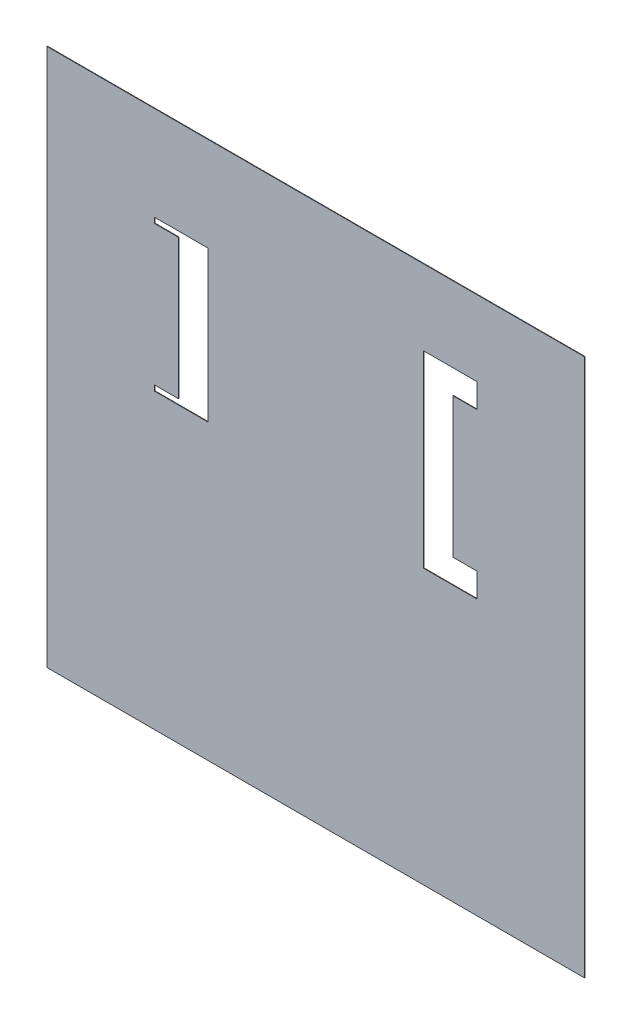
ISO-10303-21;
HEADER;
FILE_DESCRIPTION(('STEP AP214'),'2;1');
FILE_NAME('part.step','',(''),(''),'','','');
FILE_SCHEMA(('AUTOMOTIVE_DESIGN { 1 0 10303 214 1 1 1 1 }'));
ENDSEC;
DATA;
#1=APPLICATION_CONTEXT('core data for automotive mechanical design processes');
#2=APPLICATION_PROTOCOL_DEFINITION('international standard','automotive_design',2000,#1);
#3=PRODUCT_CONTEXT('',#1,'mechanical');
#4=PRODUCT('Part','Part','',(#3));
#5=PRODUCT_RELATED_PRODUCT_CATEGORY('part','',(#4));
#6=PRODUCT_DEFINITION_FORMATION('','',#4);
#7=PRODUCT_DEFINITION_CONTEXT('part definition',#1,'design');
#8=PRODUCT_DEFINITION('design','',#6,#7);
#9=PRODUCT_DEFINITION_SHAPE('','',#8);
#10=(LENGTH_UNIT() NAMED_UNIT(*) SI_UNIT(.MILLI.,.METRE.));
#11=(NAMED_UNIT(*) PLANE_ANGLE_UNIT() SI_UNIT($,.RADIAN.));
#12=(NAMED_UNIT(*) SI_UNIT($,.STERADIAN.) SOLID_ANGLE_UNIT());
#13=UNCERTAINTY_MEASURE_WITH_UNIT(LENGTH_MEASURE(1.E-05),#10,'distance_accuracy_value','');
#14=(GEOMETRIC_REPRESENTATION_CONTEXT(3) GLOBAL_UNCERTAINTY_ASSIGNED_CONTEXT((#13)) GLOBAL_UNIT_ASSIGNED_CONTEXT((#10,
#11,#12)) REPRESENTATION_CONTEXT('',''));
#15=CARTESIAN_POINT('',(0.,0.,0.));
#16=DIRECTION('',(0.,0.,1.));
#17=DIRECTION('',(1.,0.,0.));
#18=AXIS2_PLACEMENT_3D('',#15,#16,#17);
#19=CARTESIAN_POINT('',(0.,0.,0.0254));
#20=DIRECTION('',(1.,0.,0.));
#21=DIRECTION('',(0.,0.,-1.));
#22=AXIS2_PLACEMENT_3D('',#19,#20,#21);
#23=PLANE('',#22);
#24=DIRECTION('',(0.,-1.,0.));
#25=VECTOR('',#24,1.);
#26=CARTESIAN_POINT('',(0.,0.,0.));
#27=LINE('',#26,#25);
#28=CARTESIAN_POINT('',(0.,25.4,0.));
#29=VERTEX_POINT('',#28);
#30=CARTESIAN_POINT('',(0.,0.,0.));
#31=VERTEX_POINT('',#30);
#32=EDGE_CURVE('E290',#29,#31,#27,.T.);
#33=ORIENTED_EDGE('',*,*,#32,.T.);
#34=DIRECTION('',(0.,0.,-1.));
#35=VECTOR('',#34,1.);
#36=CARTESIAN_POINT('',(0.,0.,0.0254));
#37=LINE('',#36,#35);
#38=CARTESIAN_POINT('',(0.,0.,0.0254));
#39=VERTEX_POINT('',#38);
#40=EDGE_CURVE('E11',#39,#31,#37,.T.);
#41=ORIENTED_EDGE('',*,*,#40,.F.);
#42=DIRECTION('',(0.,-1.,0.));
#43=VECTOR('',#42,1.);
#44=CARTESIAN_POINT('',(0.,0.,0.0254));
#45=LINE('',#44,#43);
#46=CARTESIAN_POINT('',(0.,25.4,0.0254));
#47=VERTEX_POINT('',#46);
#48=EDGE_CURVE('E305',#47,#39,#45,.T.);
#49=ORIENTED_EDGE('',*,*,#48,.F.);
#50=DIRECTION('',(0.,0.,-1.));
#51=VECTOR('',#50,1.);
#52=CARTESIAN_POINT('',(0.,25.4,0.0254));
#53=LINE('',#52,#51);
#54=EDGE_CURVE('E315',#47,#29,#53,.T.);
#55=ORIENTED_EDGE('',*,*,#54,.T.);
#56=EDGE_LOOP('',(#33,#41,#49,#55));
#57=FACE_BOUND('',#56,.T.);
#58=ADVANCED_FACE('F36',(#57),#23,.F.);
#59=CARTESIAN_POINT('',(0.,0.,0.0254));
#60=DIRECTION('',(0.,1.,0.));
#61=DIRECTION('',(0.,0.,1.));
#62=AXIS2_PLACEMENT_3D('',#59,#60,#61);
#63=PLANE('',#62);
#64=DIRECTION('',(1.,0.,0.));
#65=VECTOR('',#64,1.);
#66=CARTESIAN_POINT('',(0.,0.,0.));
#67=LINE('',#66,#65);
#68=CARTESIAN_POINT('',(25.4,0.,0.));
#69=VERTEX_POINT('',#68);
#70=EDGE_CURVE('E318',#31,#69,#67,.T.);
#71=ORIENTED_EDGE('',*,*,#70,.T.);
#72=DIRECTION('',(0.,0.,-1.));
#73=VECTOR('',#72,1.);
#74=CARTESIAN_POINT('',(25.4,0.,0.0254));
#75=LINE('',#74,#73);
#76=CARTESIAN_POINT('',(25.4,0.,0.0254));
#77=VERTEX_POINT('',#76);
#78=EDGE_CURVE('E43',#77,#69,#75,.T.);
#79=ORIENTED_EDGE('',*,*,#78,.F.);
#80=DIRECTION('',(1.,0.,0.));
#81=VECTOR('',#80,1.);
#82=CARTESIAN_POINT('',(0.,0.,0.0254));
#83=LINE('',#82,#81);
#84=EDGE_CURVE('E308',#39,#77,#83,.T.);
#85=ORIENTED_EDGE('',*,*,#84,.F.);
#86=ORIENTED_EDGE('',*,*,#40,.T.);
#87=EDGE_LOOP('',(#71,#79,#85,#86));
#88=FACE_BOUND('',#87,.T.);
#89=ADVANCED_FACE('F347',(#88),#63,.F.);
#90=CARTESIAN_POINT('',(25.4,0.,0.0254));
#91=DIRECTION('',(-1.,0.,0.));
#92=DIRECTION('',(0.,0.,1.));
#93=AXIS2_PLACEMENT_3D('',#90,#91,#92);
#94=PLANE('',#93);
#95=DIRECTION('',(0.,1.,0.));
#96=VECTOR('',#95,1.);
#97=CARTESIAN_POINT('',(25.4,0.,0.));
#98=LINE('',#97,#96);
#99=CARTESIAN_POINT('',(25.4,25.4,0.));
#100=VERTEX_POINT('',#99);
#101=EDGE_CURVE('E320',#69,#100,#98,.T.);
#102=ORIENTED_EDGE('',*,*,#101,.T.);
#103=DIRECTION('',(0.,0.,-1.));
#104=VECTOR('',#103,1.);
#105=CARTESIAN_POINT('',(25.4,25.4,0.0254));
#106=LINE('',#105,#104);
#107=CARTESIAN_POINT('',(25.4,25.4,0.0254));
#108=VERTEX_POINT('',#107);
#109=EDGE_CURVE('E325',#108,#100,#106,.T.);
#110=ORIENTED_EDGE('',*,*,#109,.F.);
#111=DIRECTION('',(0.,1.,0.));
#112=VECTOR('',#111,1.);
#113=CARTESIAN_POINT('',(25.4,0.,0.0254));
#114=LINE('',#113,#112);
#115=EDGE_CURVE('E311',#77,#108,#114,.T.);
#116=ORIENTED_EDGE('',*,*,#115,.F.);
#117=ORIENTED_EDGE('',*,*,#78,.T.);
#118=EDGE_LOOP('',(#102,#110,#116,#117));
#119=FACE_BOUND('',#118,.T.);
#120=ADVANCED_FACE('F332',(#119),#94,.F.);
#121=CARTESIAN_POINT('',(0.,25.4,0.0254));
#122=DIRECTION('',(0.,-1.,0.));
#123=DIRECTION('',(0.,0.,-1.));
#124=AXIS2_PLACEMENT_3D('',#121,#122,#123);
#125=PLANE('',#124);
#126=DIRECTION('',(-1.,0.,0.));
#127=VECTOR('',#126,1.);
#128=CARTESIAN_POINT('',(0.,25.4,0.));
#129=LINE('',#128,#127);
#130=EDGE_CURVE('E309',#100,#29,#129,.T.);
#131=ORIENTED_EDGE('',*,*,#130,.T.);
#132=ORIENTED_EDGE('',*,*,#54,.F.);
#133=DIRECTION('',(-1.,0.,0.));
#134=VECTOR('',#133,1.);
#135=CARTESIAN_POINT('',(0.,25.4,0.0254));
#136=LINE('',#135,#134);
#137=EDGE_CURVE('E313',#108,#47,#136,.T.);
#138=ORIENTED_EDGE('',*,*,#137,.F.);
#139=ORIENTED_EDGE('',*,*,#109,.T.);
#140=EDGE_LOOP('',(#131,#132,#138,#139));
#141=FACE_BOUND('',#140,.T.);
#142=ADVANCED_FACE('F340',(#141),#125,.F.);
#143=CARTESIAN_POINT('',(0.,0.,0.0254));
#144=DIRECTION('',(0.,0.,-1.));
#145=DIRECTION('',(-1.,0.,0.));
#146=AXIS2_PLACEMENT_3D('',#143,#144,#145);
#147=PLANE('',#146);
#148=DIRECTION('',(1.,0.,0.));
#149=VECTOR('',#148,1.);
#150=CARTESIAN_POINT('',(17.78,12.954,0.0254));
#151=LINE('',#150,#149);
#152=CARTESIAN_POINT('',(17.78,12.954,0.0254));
#153=VERTEX_POINT('',#152);
#154=CARTESIAN_POINT('',(20.32,12.954,0.0254));
#155=VERTEX_POINT('',#154);
#156=EDGE_CURVE('E211',#153,#155,#151,.T.);
#157=ORIENTED_EDGE('',*,*,#156,.F.);
#158=DIRECTION('',(0.,-1.,0.));
#159=VECTOR('',#158,1.);
#160=CARTESIAN_POINT('',(17.78,21.844,0.0254));
#161=LINE('',#160,#159);
#162=CARTESIAN_POINT('',(17.78,21.844,0.0254));
#163=VERTEX_POINT('',#162);
#164=EDGE_CURVE('E50',#163,#153,#161,.T.);
#165=ORIENTED_EDGE('',*,*,#164,.F.);
#166=DIRECTION('',(-1.,0.,0.));
#167=VECTOR('',#166,1.);
#168=CARTESIAN_POINT('',(17.78,21.844,0.0254));
#169=LINE('',#168,#167);
#170=CARTESIAN_POINT('',(20.32,21.844,0.0254));
#171=VERTEX_POINT('',#170);
#172=EDGE_CURVE('E191',#171,#163,#169,.T.);
#173=ORIENTED_EDGE('',*,*,#172,.F.);
#174=DIRECTION('',(0.,1.,0.));
#175=VECTOR('',#174,1.);
#176=CARTESIAN_POINT('',(20.32,21.844,0.0254));
#177=LINE('',#176,#175);
#178=CARTESIAN_POINT('',(20.32,20.701,0.0254));
#179=VERTEX_POINT('',#178);
#180=EDGE_CURVE('E194',#179,#171,#177,.T.);
#181=ORIENTED_EDGE('',*,*,#180,.F.);
#182=DIRECTION('',(1.,0.,0.));
#183=VECTOR('',#182,1.);
#184=CARTESIAN_POINT('',(20.32,20.701,0.0254));
#185=LINE('',#184,#183);
#186=CARTESIAN_POINT('',(19.177,20.701,0.0254));
#187=VERTEX_POINT('',#186);
#188=EDGE_CURVE('E222',#187,#179,#185,.T.);
#189=ORIENTED_EDGE('',*,*,#188,.F.);
#190=DIRECTION('',(0.,1.,0.));
#191=VECTOR('',#190,1.);
#192=CARTESIAN_POINT('',(19.177,14.097,0.0254));
#193=LINE('',#192,#191);
#194=CARTESIAN_POINT('',(19.177,14.097,0.0254));
#195=VERTEX_POINT('',#194);
#196=EDGE_CURVE('E219',#195,#187,#193,.T.);
#197=ORIENTED_EDGE('',*,*,#196,.F.);
#198=DIRECTION('',(-1.,0.,0.));
#199=VECTOR('',#198,1.);
#200=CARTESIAN_POINT('',(20.32,14.097,0.0254));
#201=LINE('',#200,#199);
#202=CARTESIAN_POINT('',(20.32,14.097,0.0254));
#203=VERTEX_POINT('',#202);
#204=EDGE_CURVE('E216',#203,#195,#201,.T.);
#205=ORIENTED_EDGE('',*,*,#204,.F.);
#206=DIRECTION('',(0.,1.,0.));
#207=VECTOR('',#206,1.);
#208=CARTESIAN_POINT('',(20.32,14.097,0.0254));
#209=LINE('',#208,#207);
#210=EDGE_CURVE('E213',#155,#203,#209,.T.);
#211=ORIENTED_EDGE('',*,*,#210,.F.);
#212=EDGE_LOOP('',(#157,#165,#173,#181,#189,#197,#205,#211));
#213=FACE_BOUND('',#212,.T.);
#214=DIRECTION('',(1.,0.,0.));
#215=VECTOR('',#214,1.);
#216=CARTESIAN_POINT('',(5.08,20.701,0.0254));
#217=LINE('',#216,#215);
#218=CARTESIAN_POINT('',(5.08,20.701,0.0254));
#219=VERTEX_POINT('',#218);
#220=CARTESIAN_POINT('',(6.223,20.701,0.0254));
#221=VERTEX_POINT('',#220);
#222=EDGE_CURVE('E268',#219,#221,#217,.T.);
#223=ORIENTED_EDGE('',*,*,#222,.F.);
#224=DIRECTION('',(0.,-1.,0.));
#225=VECTOR('',#224,1.);
#226=CARTESIAN_POINT('',(5.08,20.955,0.0254));
#227=LINE('',#226,#225);
#228=CARTESIAN_POINT('',(5.08,20.955,0.0254));
#229=VERTEX_POINT('',#228);
#230=EDGE_CURVE('E229',#229,#219,#227,.T.);
#231=ORIENTED_EDGE('',*,*,#230,.F.);
#232=DIRECTION('',(-1.,0.,0.));
#233=VECTOR('',#232,1.);
#234=CARTESIAN_POINT('',(5.08,20.955,0.0254));
#235=LINE('',#234,#233);
#236=CARTESIAN_POINT('',(7.62,20.955,0.0254));
#237=VERTEX_POINT('',#236);
#238=EDGE_CURVE('E245',#237,#229,#235,.T.);
#239=ORIENTED_EDGE('',*,*,#238,.F.);
#240=DIRECTION('',(0.,1.,0.));
#241=VECTOR('',#240,1.);
#242=CARTESIAN_POINT('',(7.62,20.955,0.0254));
#243=LINE('',#242,#241);
#244=CARTESIAN_POINT('',(7.62,13.843,0.0254));
#245=VERTEX_POINT('',#244);
#246=EDGE_CURVE('E283',#245,#237,#243,.T.);
#247=ORIENTED_EDGE('',*,*,#246,.F.);
#248=DIRECTION('',(1.,0.,0.));
#249=VECTOR('',#248,1.);
#250=CARTESIAN_POINT('',(5.08,13.843,0.0254));
#251=LINE('',#250,#249);
#252=CARTESIAN_POINT('',(5.08,13.843,0.0254));
#253=VERTEX_POINT('',#252);
#254=EDGE_CURVE('E280',#253,#245,#251,.T.);
#255=ORIENTED_EDGE('',*,*,#254,.F.);
#256=DIRECTION('',(0.,-1.,0.));
#257=VECTOR('',#256,1.);
#258=CARTESIAN_POINT('',(5.08,14.097,0.0254));
#259=LINE('',#258,#257);
#260=CARTESIAN_POINT('',(5.08,14.097,0.0254));
#261=VERTEX_POINT('',#260);
#262=EDGE_CURVE('E277',#261,#253,#259,.T.);
#263=ORIENTED_EDGE('',*,*,#262,.F.);
#264=DIRECTION('',(-1.,0.,0.));
#265=VECTOR('',#264,1.);
#266=CARTESIAN_POINT('',(5.08,14.097,0.0254));
#267=LINE('',#266,#265);
#268=CARTESIAN_POINT('',(6.223,14.097,0.0254));
#269=VERTEX_POINT('',#268);
#270=EDGE_CURVE('E274',#269,#261,#267,.T.);
#271=ORIENTED_EDGE('',*,*,#270,.F.);
#272=DIRECTION('',(0.,-1.,0.));
#273=VECTOR('',#272,1.);
#274=CARTESIAN_POINT('',(6.223,14.097,0.0254));
#275=LINE('',#274,#273);
#276=EDGE_CURVE('E271',#221,#269,#275,.T.);
#277=ORIENTED_EDGE('',*,*,#276,.F.);
#278=EDGE_LOOP('',(#223,#231,#239,#247,#255,#263,#271,#277));
#279=FACE_BOUND('',#278,.T.);
#280=ORIENTED_EDGE('',*,*,#48,.T.);
#281=ORIENTED_EDGE('',*,*,#84,.T.);
#282=ORIENTED_EDGE('',*,*,#115,.T.);
#283=ORIENTED_EDGE('',*,*,#137,.T.);
#284=EDGE_LOOP('',(#280,#281,#282,#283));
#285=FACE_BOUND('',#284,.T.);
#286=ADVANCED_FACE('F346',(#213,#279,#285),#147,.F.);
#287=CARTESIAN_POINT('',(0.,0.,0.));
#288=DIRECTION('',(0.,0.,-1.));
#289=DIRECTION('',(-1.,0.,0.));
#290=AXIS2_PLACEMENT_3D('',#287,#288,#289);
#291=PLANE('',#290);
#292=DIRECTION('',(0.,-1.,0.));
#293=VECTOR('',#292,1.);
#294=CARTESIAN_POINT('',(17.78,21.844,0.));
#295=LINE('',#294,#293);
#296=CARTESIAN_POINT('',(17.78,21.844,0.));
#297=VERTEX_POINT('',#296);
#298=CARTESIAN_POINT('',(17.78,12.954,0.));
#299=VERTEX_POINT('',#298);
#300=EDGE_CURVE('E174',#297,#299,#295,.T.);
#301=ORIENTED_EDGE('',*,*,#300,.T.);
#302=DIRECTION('',(1.,0.,0.));
#303=VECTOR('',#302,1.);
#304=CARTESIAN_POINT('',(17.78,12.954,0.));
#305=LINE('',#304,#303);
#306=CARTESIAN_POINT('',(20.32,12.954,0.));
#307=VERTEX_POINT('',#306);
#308=EDGE_CURVE('E183',#299,#307,#305,.T.);
#309=ORIENTED_EDGE('',*,*,#308,.T.);
#310=DIRECTION('',(0.,1.,0.));
#311=VECTOR('',#310,1.);
#312=CARTESIAN_POINT('',(20.32,14.097,0.));
#313=LINE('',#312,#311);
#314=CARTESIAN_POINT('',(20.32,14.097,0.));
#315=VERTEX_POINT('',#314);
#316=EDGE_CURVE('E58',#307,#315,#313,.T.);
#317=ORIENTED_EDGE('',*,*,#316,.T.);
#318=DIRECTION('',(-1.,0.,0.));
#319=VECTOR('',#318,1.);
#320=CARTESIAN_POINT('',(20.32,14.097,0.));
#321=LINE('',#320,#319);
#322=CARTESIAN_POINT('',(19.177,14.097,0.));
#323=VERTEX_POINT('',#322);
#324=EDGE_CURVE('E198',#315,#323,#321,.T.);
#325=ORIENTED_EDGE('',*,*,#324,.T.);
#326=DIRECTION('',(0.,1.,0.));
#327=VECTOR('',#326,1.);
#328=CARTESIAN_POINT('',(19.177,14.097,0.));
#329=LINE('',#328,#327);
#330=CARTESIAN_POINT('',(19.177,20.701,0.));
#331=VERTEX_POINT('',#330);
#332=EDGE_CURVE('E201',#323,#331,#329,.T.);
#333=ORIENTED_EDGE('',*,*,#332,.T.);
#334=DIRECTION('',(1.,0.,0.));
#335=VECTOR('',#334,1.);
#336=CARTESIAN_POINT('',(20.32,20.701,0.));
#337=LINE('',#336,#335);
#338=CARTESIAN_POINT('',(20.32,20.701,0.));
#339=VERTEX_POINT('',#338);
#340=EDGE_CURVE('E204',#331,#339,#337,.T.);
#341=ORIENTED_EDGE('',*,*,#340,.T.);
#342=DIRECTION('',(0.,1.,0.));
#343=VECTOR('',#342,1.);
#344=CARTESIAN_POINT('',(20.32,21.844,0.));
#345=LINE('',#344,#343);
#346=CARTESIAN_POINT('',(20.32,21.844,0.));
#347=VERTEX_POINT('',#346);
#348=EDGE_CURVE('E207',#339,#347,#345,.T.);
#349=ORIENTED_EDGE('',*,*,#348,.T.);
#350=DIRECTION('',(-1.,0.,0.));
#351=VECTOR('',#350,1.);
#352=CARTESIAN_POINT('',(17.78,21.844,0.));
#353=LINE('',#352,#351);
#354=EDGE_CURVE('E180',#347,#297,#353,.T.);
#355=ORIENTED_EDGE('',*,*,#354,.T.);
#356=EDGE_LOOP('',(#301,#309,#317,#325,#333,#341,#349,#355));
#357=FACE_BOUND('',#356,.T.);
#358=DIRECTION('',(0.,-1.,0.));
#359=VECTOR('',#358,1.);
#360=CARTESIAN_POINT('',(5.08,20.955,0.));
#361=LINE('',#360,#359);
#362=CARTESIAN_POINT('',(5.08,20.955,0.));
#363=VERTEX_POINT('',#362);
#364=CARTESIAN_POINT('',(5.08,20.701,0.));
#365=VERTEX_POINT('',#364);
#366=EDGE_CURVE('E241',#363,#365,#361,.T.);
#367=ORIENTED_EDGE('',*,*,#366,.T.);
#368=DIRECTION('',(1.,0.,0.));
#369=VECTOR('',#368,1.);
#370=CARTESIAN_POINT('',(5.08,20.701,0.));
#371=LINE('',#370,#369);
#372=CARTESIAN_POINT('',(6.223,20.701,0.));
#373=VERTEX_POINT('',#372);
#374=EDGE_CURVE('E244',#365,#373,#371,.T.);
#375=ORIENTED_EDGE('',*,*,#374,.T.);
#376=DIRECTION('',(0.,-1.,0.));
#377=VECTOR('',#376,1.);
#378=CARTESIAN_POINT('',(6.223,14.097,0.));
#379=LINE('',#378,#377);
#380=CARTESIAN_POINT('',(6.223,14.097,0.));
#381=VERTEX_POINT('',#380);
#382=EDGE_CURVE('E248',#373,#381,#379,.T.);
#383=ORIENTED_EDGE('',*,*,#382,.T.);
#384=DIRECTION('',(-1.,0.,0.));
#385=VECTOR('',#384,1.);
#386=CARTESIAN_POINT('',(5.08,14.097,0.));
#387=LINE('',#386,#385);
#388=CARTESIAN_POINT('',(5.08,14.097,0.));
#389=VERTEX_POINT('',#388);
#390=EDGE_CURVE('E251',#381,#389,#387,.T.);
#391=ORIENTED_EDGE('',*,*,#390,.T.);
#392=DIRECTION('',(0.,-1.,0.));
#393=VECTOR('',#392,1.);
#394=CARTESIAN_POINT('',(5.08,14.097,0.));
#395=LINE('',#394,#393);
#396=CARTESIAN_POINT('',(5.08,13.843,0.));
#397=VERTEX_POINT('',#396);
#398=EDGE_CURVE('E254',#389,#397,#395,.T.);
#399=ORIENTED_EDGE('',*,*,#398,.T.);
#400=DIRECTION('',(1.,0.,0.));
#401=VECTOR('',#400,1.);
#402=CARTESIAN_POINT('',(5.08,13.843,0.));
#403=LINE('',#402,#401);
#404=CARTESIAN_POINT('',(7.62,13.843,0.));
#405=VERTEX_POINT('',#404);
#406=EDGE_CURVE('E257',#397,#405,#403,.T.);
#407=ORIENTED_EDGE('',*,*,#406,.T.);
#408=DIRECTION('',(0.,1.,0.));
#409=VECTOR('',#408,1.);
#410=CARTESIAN_POINT('',(7.62,20.955,0.));
#411=LINE('',#410,#409);
#412=CARTESIAN_POINT('',(7.62,20.955,0.));
#413=VERTEX_POINT('',#412);
#414=EDGE_CURVE('E260',#405,#413,#411,.T.);
#415=ORIENTED_EDGE('',*,*,#414,.T.);
#416=DIRECTION('',(-1.,0.,0.));
#417=VECTOR('',#416,1.);
#418=CARTESIAN_POINT('',(5.08,20.955,0.));
#419=LINE('',#418,#417);
#420=EDGE_CURVE('E263',#413,#363,#419,.T.);
#421=ORIENTED_EDGE('',*,*,#420,.T.);
#422=EDGE_LOOP('',(#367,#375,#383,#391,#399,#407,#415,#421));
#423=FACE_BOUND('',#422,.T.);
#424=ORIENTED_EDGE('',*,*,#32,.F.);
#425=ORIENTED_EDGE('',*,*,#130,.F.);
#426=ORIENTED_EDGE('',*,*,#101,.F.);
#427=ORIENTED_EDGE('',*,*,#70,.F.);
#428=EDGE_LOOP('',(#424,#425,#426,#427));
#429=FACE_BOUND('',#428,.T.);
#430=ADVANCED_FACE('F187',(#357,#423,#429),#291,.T.);
#431=CARTESIAN_POINT('',(5.08,20.955,0.));
#432=DIRECTION('',(-1.,0.,0.));
#433=DIRECTION('',(0.,-1.,0.));
#434=AXIS2_PLACEMENT_3D('',#431,#432,#433);
#435=PLANE('',#434);
#436=ORIENTED_EDGE('',*,*,#230,.T.);
#437=DIRECTION('',(0.,0.,1.));
#438=VECTOR('',#437,1.);
#439=CARTESIAN_POINT('',(5.08,20.701,0.));
#440=LINE('',#439,#438);
#441=EDGE_CURVE('E266',#365,#219,#440,.T.);
#442=ORIENTED_EDGE('',*,*,#441,.F.);
#443=ORIENTED_EDGE('',*,*,#366,.F.);
#444=DIRECTION('',(0.,0.,1.));
#445=VECTOR('',#444,1.);
#446=CARTESIAN_POINT('',(5.08,20.955,0.));
#447=LINE('',#446,#445);
#448=EDGE_CURVE('E288',#363,#229,#447,.T.);
#449=ORIENTED_EDGE('',*,*,#448,.T.);
#450=EDGE_LOOP('',(#436,#442,#443,#449));
#451=FACE_BOUND('',#450,.T.);
#452=ADVANCED_FACE('F359',(#451),#435,.F.);
#453=CARTESIAN_POINT('',(5.08,20.955,0.));
#454=DIRECTION('',(0.,1.,0.));
#455=DIRECTION('',(0.,0.,1.));
#456=AXIS2_PLACEMENT_3D('',#453,#454,#455);
#457=PLANE('',#456);
#458=ORIENTED_EDGE('',*,*,#238,.T.);
#459=ORIENTED_EDGE('',*,*,#448,.F.);
#460=ORIENTED_EDGE('',*,*,#420,.F.);
#461=DIRECTION('',(0.,0.,1.));
#462=VECTOR('',#461,1.);
#463=CARTESIAN_POINT('',(7.62,20.955,0.));
#464=LINE('',#463,#462);
#465=EDGE_CURVE('E291',#413,#237,#464,.T.);
#466=ORIENTED_EDGE('',*,*,#465,.T.);
#467=EDGE_LOOP('',(#458,#459,#460,#466));
#468=FACE_BOUND('',#467,.T.);
#469=ADVANCED_FACE('F365',(#468),#457,.F.);
#470=CARTESIAN_POINT('',(7.62,20.955,0.));
#471=DIRECTION('',(1.,0.,0.));
#472=DIRECTION('',(0.,0.,-1.));
#473=AXIS2_PLACEMENT_3D('',#470,#471,#472);
#474=PLANE('',#473);
#475=ORIENTED_EDGE('',*,*,#246,.T.);
#476=ORIENTED_EDGE('',*,*,#465,.F.);
#477=ORIENTED_EDGE('',*,*,#414,.F.);
#478=DIRECTION('',(0.,0.,1.));
#479=VECTOR('',#478,1.);
#480=CARTESIAN_POINT('',(7.62,13.843,0.));
#481=LINE('',#480,#479);
#482=EDGE_CURVE('E293',#405,#245,#481,.T.);
#483=ORIENTED_EDGE('',*,*,#482,.T.);
#484=EDGE_LOOP('',(#475,#476,#477,#483));
#485=FACE_BOUND('',#484,.T.);
#486=ADVANCED_FACE('F386',(#485),#474,.F.);
#487=CARTESIAN_POINT('',(5.08,13.843,0.));
#488=DIRECTION('',(0.,-1.,0.));
#489=DIRECTION('',(0.,0.,-1.));
#490=AXIS2_PLACEMENT_3D('',#487,#488,#489);
#491=PLANE('',#490);
#492=ORIENTED_EDGE('',*,*,#254,.T.);
#493=ORIENTED_EDGE('',*,*,#482,.F.);
#494=ORIENTED_EDGE('',*,*,#406,.F.);
#495=DIRECTION('',(0.,0.,1.));
#496=VECTOR('',#495,1.);
#497=CARTESIAN_POINT('',(5.08,13.843,0.));
#498=LINE('',#497,#496);
#499=EDGE_CURVE('E295',#397,#253,#498,.T.);
#500=ORIENTED_EDGE('',*,*,#499,.T.);
#501=EDGE_LOOP('',(#492,#493,#494,#500));
#502=FACE_BOUND('',#501,.T.);
#503=ADVANCED_FACE('F382',(#502),#491,.F.);
#504=CARTESIAN_POINT('',(5.08,14.097,0.));
#505=DIRECTION('',(-1.,0.,0.));
#506=DIRECTION('',(0.,0.,1.));
#507=AXIS2_PLACEMENT_3D('',#504,#505,#506);
#508=PLANE('',#507);
#509=ORIENTED_EDGE('',*,*,#262,.T.);
#510=ORIENTED_EDGE('',*,*,#499,.F.);
#511=ORIENTED_EDGE('',*,*,#398,.F.);
#512=DIRECTION('',(0.,0.,1.));
#513=VECTOR('',#512,1.);
#514=CARTESIAN_POINT('',(5.08,14.097,0.));
#515=LINE('',#514,#513);
#516=EDGE_CURVE('E297',#389,#261,#515,.T.);
#517=ORIENTED_EDGE('',*,*,#516,.T.);
#518=EDGE_LOOP('',(#509,#510,#511,#517));
#519=FACE_BOUND('',#518,.T.);
#520=ADVANCED_FACE('F378',(#519),#508,.F.);
#521=CARTESIAN_POINT('',(5.08,14.097,0.));
#522=DIRECTION('',(0.,1.,0.));
#523=DIRECTION('',(0.,0.,1.));
#524=AXIS2_PLACEMENT_3D('',#521,#522,#523);
#525=PLANE('',#524);
#526=ORIENTED_EDGE('',*,*,#270,.T.);
#527=ORIENTED_EDGE('',*,*,#516,.F.);
#528=ORIENTED_EDGE('',*,*,#390,.F.);
#529=DIRECTION('',(0.,0.,1.));
#530=VECTOR('',#529,1.);
#531=CARTESIAN_POINT('',(6.223,14.097,0.));
#532=LINE('',#531,#530);
#533=EDGE_CURVE('E299',#381,#269,#532,.T.);
#534=ORIENTED_EDGE('',*,*,#533,.T.);
#535=EDGE_LOOP('',(#526,#527,#528,#534));
#536=FACE_BOUND('',#535,.T.);
#537=ADVANCED_FACE('F374',(#536),#525,.F.);
#538=CARTESIAN_POINT('',(6.223,14.097,0.));
#539=DIRECTION('',(-1.,0.,0.));
#540=DIRECTION('',(0.,0.,1.));
#541=AXIS2_PLACEMENT_3D('',#538,#539,#540);
#542=PLANE('',#541);
#543=ORIENTED_EDGE('',*,*,#276,.T.);
#544=ORIENTED_EDGE('',*,*,#533,.F.);
#545=ORIENTED_EDGE('',*,*,#382,.F.);
#546=DIRECTION('',(0.,0.,1.));
#547=VECTOR('',#546,1.);
#548=CARTESIAN_POINT('',(6.223,20.701,0.));
#549=LINE('',#548,#547);
#550=EDGE_CURVE('E301',#373,#221,#549,.T.);
#551=ORIENTED_EDGE('',*,*,#550,.T.);
#552=EDGE_LOOP('',(#543,#544,#545,#551));
#553=FACE_BOUND('',#552,.T.);
#554=ADVANCED_FACE('F370',(#553),#542,.F.);
#555=CARTESIAN_POINT('',(5.08,20.701,0.));
#556=DIRECTION('',(0.,-1.,0.));
#557=DIRECTION('',(0.,0.,-1.));
#558=AXIS2_PLACEMENT_3D('',#555,#556,#557);
#559=PLANE('',#558);
#560=ORIENTED_EDGE('',*,*,#222,.T.);
#561=ORIENTED_EDGE('',*,*,#550,.F.);
#562=ORIENTED_EDGE('',*,*,#374,.F.);
#563=ORIENTED_EDGE('',*,*,#441,.T.);
#564=EDGE_LOOP('',(#560,#561,#562,#563));
#565=FACE_BOUND('',#564,.T.);
#566=ADVANCED_FACE('F367',(#565),#559,.F.);
#567=CARTESIAN_POINT('',(17.78,21.844,0.));
#568=DIRECTION('',(-1.,0.,0.));
#569=DIRECTION('',(0.,-1.,0.));
#570=AXIS2_PLACEMENT_3D('',#567,#568,#569);
#571=PLANE('',#570);
#572=ORIENTED_EDGE('',*,*,#164,.T.);
#573=DIRECTION('',(0.,0.,1.));
#574=VECTOR('',#573,1.);
#575=CARTESIAN_POINT('',(17.78,12.954,0.));
#576=LINE('',#575,#574);
#577=EDGE_CURVE('E170',#299,#153,#576,.T.);
#578=ORIENTED_EDGE('',*,*,#577,.F.);
#579=ORIENTED_EDGE('',*,*,#300,.F.);
#580=DIRECTION('',(0.,0.,1.));
#581=VECTOR('',#580,1.);
#582=CARTESIAN_POINT('',(17.78,21.844,0.));
#583=LINE('',#582,#581);
#584=EDGE_CURVE('E227',#297,#163,#583,.T.);
#585=ORIENTED_EDGE('',*,*,#584,.T.);
#586=EDGE_LOOP('',(#572,#578,#579,#585));
#587=FACE_BOUND('',#586,.T.);
#588=ADVANCED_FACE('F172',(#587),#571,.F.);
#589=CARTESIAN_POINT('',(17.78,21.844,0.));
#590=DIRECTION('',(0.,1.,0.));
#591=DIRECTION('',(0.,0.,1.));
#592=AXIS2_PLACEMENT_3D('',#589,#590,#591);
#593=PLANE('',#592);
#594=ORIENTED_EDGE('',*,*,#172,.T.);
#595=ORIENTED_EDGE('',*,*,#584,.F.);
#596=ORIENTED_EDGE('',*,*,#354,.F.);
#597=DIRECTION('',(0.,0.,1.));
#598=VECTOR('',#597,1.);
#599=CARTESIAN_POINT('',(20.32,21.844,0.));
#600=LINE('',#599,#598);
#601=EDGE_CURVE('E230',#347,#171,#600,.T.);
#602=ORIENTED_EDGE('',*,*,#601,.T.);
#603=EDGE_LOOP('',(#594,#595,#596,#602));
#604=FACE_BOUND('',#603,.T.);
#605=ADVANCED_FACE('F396',(#604),#593,.F.);
#606=CARTESIAN_POINT('',(20.32,21.844,0.));
#607=DIRECTION('',(1.,0.,0.));
#608=DIRECTION('',(0.,1.,0.));
#609=AXIS2_PLACEMENT_3D('',#606,#607,#608);
#610=PLANE('',#609);
#611=ORIENTED_EDGE('',*,*,#180,.T.);
#612=ORIENTED_EDGE('',*,*,#601,.F.);
#613=ORIENTED_EDGE('',*,*,#348,.F.);
#614=DIRECTION('',(0.,0.,1.));
#615=VECTOR('',#614,1.);
#616=CARTESIAN_POINT('',(20.32,20.701,0.));
#617=LINE('',#616,#615);
#618=EDGE_CURVE('E232',#339,#179,#617,.T.);
#619=ORIENTED_EDGE('',*,*,#618,.T.);
#620=EDGE_LOOP('',(#611,#612,#613,#619));
#621=FACE_BOUND('',#620,.T.);
#622=ADVANCED_FACE('F413',(#621),#610,.F.);
#623=CARTESIAN_POINT('',(20.32,20.701,0.));
#624=DIRECTION('',(0.,-1.,0.));
#625=DIRECTION('',(0.,0.,-1.));
#626=AXIS2_PLACEMENT_3D('',#623,#624,#625);
#627=PLANE('',#626);
#628=ORIENTED_EDGE('',*,*,#188,.T.);
#629=ORIENTED_EDGE('',*,*,#618,.F.);
#630=ORIENTED_EDGE('',*,*,#340,.F.);
#631=DIRECTION('',(0.,0.,1.));
#632=VECTOR('',#631,1.);
#633=CARTESIAN_POINT('',(19.177,20.701,0.));
#634=LINE('',#633,#632);
#635=EDGE_CURVE('E234',#331,#187,#634,.T.);
#636=ORIENTED_EDGE('',*,*,#635,.T.);
#637=EDGE_LOOP('',(#628,#629,#630,#636));
#638=FACE_BOUND('',#637,.T.);
#639=ADVANCED_FACE('F409',(#638),#627,.F.);
#640=CARTESIAN_POINT('',(19.177,14.097,0.));
#641=DIRECTION('',(1.,0.,0.));
#642=DIRECTION('',(0.,0.,-1.));
#643=AXIS2_PLACEMENT_3D('',#640,#641,#642);
#644=PLANE('',#643);
#645=ORIENTED_EDGE('',*,*,#196,.T.);
#646=ORIENTED_EDGE('',*,*,#635,.F.);
#647=ORIENTED_EDGE('',*,*,#332,.F.);
#648=DIRECTION('',(0.,0.,1.));
#649=VECTOR('',#648,1.);
#650=CARTESIAN_POINT('',(19.177,14.097,0.));
#651=LINE('',#650,#649);
#652=EDGE_CURVE('E236',#323,#195,#651,.T.);
#653=ORIENTED_EDGE('',*,*,#652,.T.);
#654=EDGE_LOOP('',(#645,#646,#647,#653));
#655=FACE_BOUND('',#654,.T.);
#656=ADVANCED_FACE('F405',(#655),#644,.F.);
#657=CARTESIAN_POINT('',(20.32,14.097,0.));
#658=DIRECTION('',(0.,1.,0.));
#659=DIRECTION('',(0.,0.,1.));
#660=AXIS2_PLACEMENT_3D('',#657,#658,#659);
#661=PLANE('',#660);
#662=ORIENTED_EDGE('',*,*,#204,.T.);
#663=ORIENTED_EDGE('',*,*,#652,.F.);
#664=ORIENTED_EDGE('',*,*,#324,.F.);
#665=DIRECTION('',(0.,0.,1.));
#666=VECTOR('',#665,1.);
#667=CARTESIAN_POINT('',(20.32,14.097,0.));
#668=LINE('',#667,#666);
#669=EDGE_CURVE('E238',#315,#203,#668,.T.);
#670=ORIENTED_EDGE('',*,*,#669,.T.);
#671=EDGE_LOOP('',(#662,#663,#664,#670));
#672=FACE_BOUND('',#671,.T.);
#673=ADVANCED_FACE('F402',(#672),#661,.F.);
#674=CARTESIAN_POINT('',(20.32,14.097,0.));
#675=DIRECTION('',(1.,0.,0.));
#676=DIRECTION('',(0.,1.,0.));
#677=AXIS2_PLACEMENT_3D('',#674,#675,#676);
#678=PLANE('',#677);
#679=ORIENTED_EDGE('',*,*,#210,.T.);
#680=ORIENTED_EDGE('',*,*,#669,.F.);
#681=ORIENTED_EDGE('',*,*,#316,.F.);
#682=DIRECTION('',(0.,0.,1.));
#683=VECTOR('',#682,1.);
#684=CARTESIAN_POINT('',(20.32,12.954,0.));
#685=LINE('',#684,#683);
#686=EDGE_CURVE('E179',#307,#155,#685,.T.);
#687=ORIENTED_EDGE('',*,*,#686,.T.);
#688=EDGE_LOOP('',(#679,#680,#681,#687));
#689=FACE_BOUND('',#688,.T.);
#690=ADVANCED_FACE('F399',(#689),#678,.F.);
#691=CARTESIAN_POINT('',(17.78,12.954,0.));
#692=DIRECTION('',(0.,-1.,0.));
#693=DIRECTION('',(0.,0.,-1.));
#694=AXIS2_PLACEMENT_3D('',#691,#692,#693);
#695=PLANE('',#694);
#696=ORIENTED_EDGE('',*,*,#156,.T.);
#697=ORIENTED_EDGE('',*,*,#686,.F.);
#698=ORIENTED_EDGE('',*,*,#308,.F.);
#699=ORIENTED_EDGE('',*,*,#577,.T.);
#700=EDGE_LOOP('',(#696,#697,#698,#699));
#701=FACE_BOUND('',#700,.T.);
#702=ADVANCED_FACE('F184',(#701),#695,.F.);
#703=CLOSED_SHELL('',(#58,#89,#120,#142,#286,#430,#452,#469,#486,#503,#520,#537,#554,#566,#588,
#605,#622,#639,#656,#673,#690,#702));
#704=MANIFOLD_SOLID_BREP('B2',#703);
#705=ADVANCED_BREP_SHAPE_REPRESENTATION('',(#18,#704),#14);
#706=SHAPE_DEFINITION_REPRESENTATION(#9,#705);
ENDSEC;
END-ISO-10303-21;
